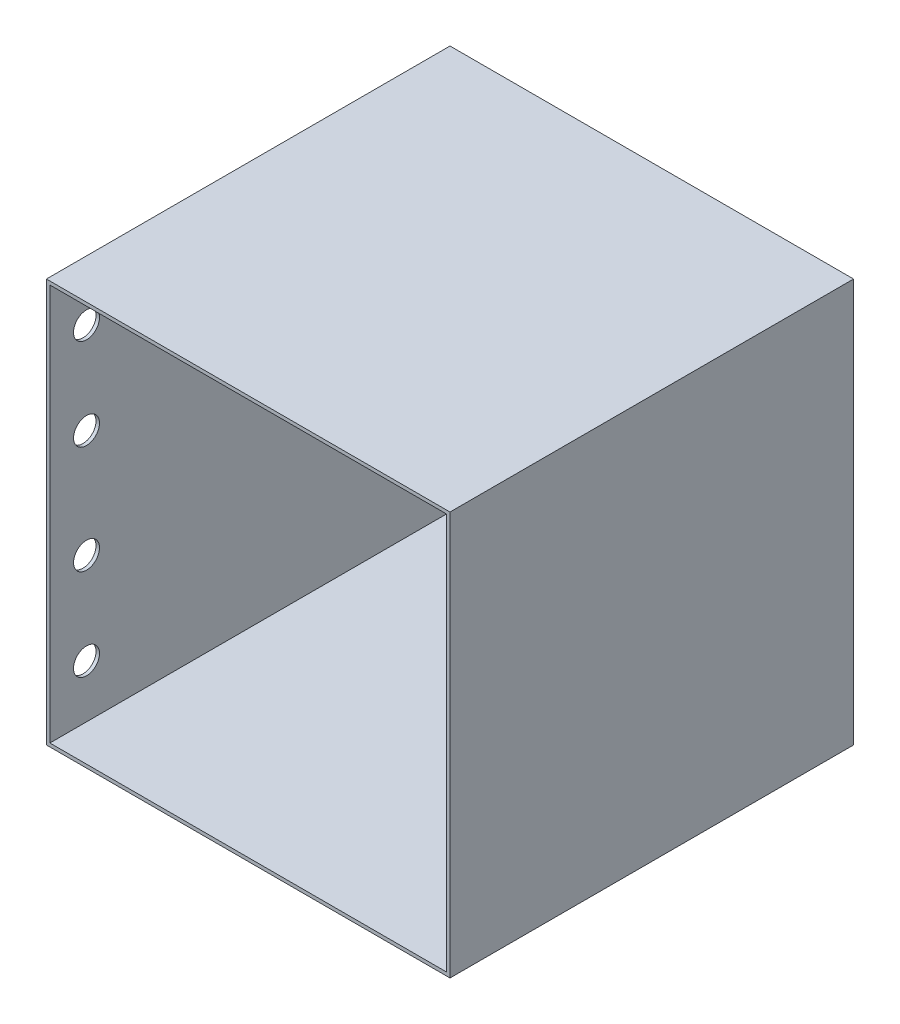
ISO-10303-21;
HEADER;
FILE_DESCRIPTION(('STEP AP214'),'2;1');
FILE_NAME('part.step','',(''),(''),'','','');
FILE_SCHEMA(('AUTOMOTIVE_DESIGN { 1 0 10303 214 1 1 1 1 }'));
ENDSEC;
DATA;
#1=APPLICATION_CONTEXT('core data for automotive mechanical design processes');
#2=APPLICATION_PROTOCOL_DEFINITION('international standard','automotive_design',2000,#1);
#3=PRODUCT_CONTEXT('',#1,'mechanical');
#4=PRODUCT('Part','Part','',(#3));
#5=PRODUCT_RELATED_PRODUCT_CATEGORY('part','',(#4));
#6=PRODUCT_DEFINITION_FORMATION('','',#4);
#7=PRODUCT_DEFINITION_CONTEXT('part definition',#1,'design');
#8=PRODUCT_DEFINITION('design','',#6,#7);
#9=PRODUCT_DEFINITION_SHAPE('','',#8);
#10=(LENGTH_UNIT() NAMED_UNIT(*) SI_UNIT(.MILLI.,.METRE.));
#11=(NAMED_UNIT(*) PLANE_ANGLE_UNIT() SI_UNIT($,.RADIAN.));
#12=(NAMED_UNIT(*) SI_UNIT($,.STERADIAN.) SOLID_ANGLE_UNIT());
#13=UNCERTAINTY_MEASURE_WITH_UNIT(LENGTH_MEASURE(1.E-05),#10,'distance_accuracy_value','');
#14=(GEOMETRIC_REPRESENTATION_CONTEXT(3) GLOBAL_UNCERTAINTY_ASSIGNED_CONTEXT((#13)) GLOBAL_UNIT_ASSIGNED_CONTEXT((#10,
#11,#12)) REPRESENTATION_CONTEXT('',''));
#15=CARTESIAN_POINT('',(0.,0.,0.));
#16=DIRECTION('',(0.,0.,1.));
#17=DIRECTION('',(1.,0.,0.));
#18=AXIS2_PLACEMENT_3D('',#15,#16,#17);
#19=CARTESIAN_POINT('',(0.,0.,70.));
#20=DIRECTION('',(0.,0.,-1.));
#21=DIRECTION('',(-1.,0.,0.));
#22=AXIS2_PLACEMENT_3D('',#19,#20,#21);
#23=PLANE('',#22);
#24=DIRECTION('',(0.,-1.,0.));
#25=VECTOR('',#24,1.);
#26=CARTESIAN_POINT('',(0.,0.,70.));
#27=LINE('',#26,#25);
#28=CARTESIAN_POINT('',(-1.11022302462516E-13,70.0000000000001,69.9999999999997));
#29=VERTEX_POINT('',#28);
#30=CARTESIAN_POINT('',(0.,0.,70.));
#31=VERTEX_POINT('',#30);
#32=EDGE_CURVE('E134',#29,#31,#27,.T.);
#33=ORIENTED_EDGE('',*,*,#32,.T.);
#34=DIRECTION('',(1.,0.,0.));
#35=VECTOR('',#34,1.);
#36=CARTESIAN_POINT('',(0.,0.,70.));
#37=LINE('',#36,#35);
#38=CARTESIAN_POINT('',(70.,0.,70.));
#39=VERTEX_POINT('',#38);
#40=EDGE_CURVE('E137',#31,#39,#37,.T.);
#41=ORIENTED_EDGE('',*,*,#40,.T.);
#42=DIRECTION('',(0.,1.,0.));
#43=VECTOR('',#42,1.);
#44=CARTESIAN_POINT('',(70.,0.,70.));
#45=LINE('',#44,#43);
#46=CARTESIAN_POINT('',(69.9999999999998,69.9999999999998,69.9999999999997));
#47=VERTEX_POINT('',#46);
#48=EDGE_CURVE('E140',#39,#47,#45,.T.);
#49=ORIENTED_EDGE('',*,*,#48,.T.);
#50=DIRECTION('',(-1.,0.,0.));
#51=VECTOR('',#50,1.);
#52=CARTESIAN_POINT('',(-1.11022302462516E-13,70.0000000000001,69.9999999999997));
#53=LINE('',#52,#51);
#54=EDGE_CURVE('E142',#47,#29,#53,.T.);
#55=ORIENTED_EDGE('',*,*,#54,.T.);
#56=EDGE_LOOP('',(#33,#41,#49,#55));
#57=FACE_BOUND('',#56,.T.);
#58=DIRECTION('',(0.,-1.,0.));
#59=VECTOR('',#58,1.);
#60=CARTESIAN_POINT('',(0.599999999999934,0.,70.));
#61=LINE('',#60,#59);
#62=CARTESIAN_POINT('',(0.599999999999518,69.3999999999999,69.9999999999997));
#63=VERTEX_POINT('',#62);
#64=CARTESIAN_POINT('',(0.600000000000045,0.599999999999934,70.));
#65=VERTEX_POINT('',#64);
#66=EDGE_CURVE('E122',#63,#65,#61,.T.);
#67=ORIENTED_EDGE('',*,*,#66,.F.);
#68=DIRECTION('',(-1.,0.,0.));
#69=VECTOR('',#68,1.);
#70=CARTESIAN_POINT('',(-5.27355936696949E-13,69.3999999999999,69.9999999999997));
#71=LINE('',#70,#69);
#72=CARTESIAN_POINT('',(69.3999999999998,69.3999999999999,69.9999999999997));
#73=VERTEX_POINT('',#72);
#74=EDGE_CURVE('E106',#73,#63,#71,.T.);
#75=ORIENTED_EDGE('',*,*,#74,.F.);
#76=DIRECTION('',(0.,1.,0.));
#77=VECTOR('',#76,1.);
#78=CARTESIAN_POINT('',(69.4,0.,70.));
#79=LINE('',#78,#77);
#80=CARTESIAN_POINT('',(69.4,0.599999999999934,70.));
#81=VERTEX_POINT('',#80);
#82=EDGE_CURVE('E131',#81,#73,#79,.T.);
#83=ORIENTED_EDGE('',*,*,#82,.F.);
#84=DIRECTION('',(1.,0.,0.));
#85=VECTOR('',#84,1.);
#86=CARTESIAN_POINT('',(0.,0.599999999999934,70.));
#87=LINE('',#86,#85);
#88=EDGE_CURVE('E124',#65,#81,#87,.T.);
#89=ORIENTED_EDGE('',*,*,#88,.F.);
#90=EDGE_LOOP('',(#67,#75,#83,#89));
#91=FACE_BOUND('',#90,.T.);
#92=ADVANCED_FACE('F36',(#57,#91),#23,.F.);
#93=CARTESIAN_POINT('',(0.,0.,0.));
#94=DIRECTION('',(0.,0.,-1.));
#95=DIRECTION('',(-1.,0.,0.));
#96=AXIS2_PLACEMENT_3D('',#93,#94,#95);
#97=PLANE('',#96);
#98=DIRECTION('',(0.,-1.,0.));
#99=VECTOR('',#98,1.);
#100=CARTESIAN_POINT('',(0.,0.,0.));
#101=LINE('',#100,#99);
#102=CARTESIAN_POINT('',(-1.11022302462516E-13,70.0000000000001,-3.33066907387547E-13));
#103=VERTEX_POINT('',#102);
#104=CARTESIAN_POINT('',(0.,0.,0.));
#105=VERTEX_POINT('',#104);
#106=EDGE_CURVE('E145',#103,#105,#101,.T.);
#107=ORIENTED_EDGE('',*,*,#106,.F.);
#108=DIRECTION('',(-1.,0.,0.));
#109=VECTOR('',#108,1.);
#110=CARTESIAN_POINT('',(-1.11022302462516E-13,70.0000000000001,-3.33066907387547E-13));
#111=LINE('',#110,#109);
#112=CARTESIAN_POINT('',(69.9999999999998,70.0000000000001,-3.33066907387547E-13));
#113=VERTEX_POINT('',#112);
#114=EDGE_CURVE('E138',#113,#103,#111,.T.);
#115=ORIENTED_EDGE('',*,*,#114,.F.);
#116=DIRECTION('',(0.,1.,0.));
#117=VECTOR('',#116,1.);
#118=CARTESIAN_POINT('',(70.,0.,0.));
#119=LINE('',#118,#117);
#120=CARTESIAN_POINT('',(70.,0.,0.));
#121=VERTEX_POINT('',#120);
#122=EDGE_CURVE('E150',#121,#113,#119,.T.);
#123=ORIENTED_EDGE('',*,*,#122,.F.);
#124=DIRECTION('',(1.,0.,0.));
#125=VECTOR('',#124,1.);
#126=CARTESIAN_POINT('',(0.,0.,0.));
#127=LINE('',#126,#125);
#128=EDGE_CURVE('E148',#105,#121,#127,.T.);
#129=ORIENTED_EDGE('',*,*,#128,.F.);
#130=EDGE_LOOP('',(#107,#115,#123,#129));
#131=FACE_BOUND('',#130,.T.);
#132=DIRECTION('',(-1.,0.,0.));
#133=VECTOR('',#132,1.);
#134=CARTESIAN_POINT('',(-5.27355936696949E-13,69.3999999999999,-3.33066907387547E-13));
#135=LINE('',#134,#133);
#136=CARTESIAN_POINT('',(69.3999999999998,69.3999999999999,-3.33066907387547E-13));
#137=VERTEX_POINT('',#136);
#138=CARTESIAN_POINT('',(0.599999999999518,69.3999999999999,-3.33066907387547E-13));
#139=VERTEX_POINT('',#138);
#140=EDGE_CURVE('E104',#137,#139,#135,.T.);
#141=ORIENTED_EDGE('',*,*,#140,.T.);
#142=DIRECTION('',(0.,-1.,0.));
#143=VECTOR('',#142,1.);
#144=CARTESIAN_POINT('',(0.599999999999934,0.,0.));
#145=LINE('',#144,#143);
#146=CARTESIAN_POINT('',(0.600000000000045,0.599999999999934,0.));
#147=VERTEX_POINT('',#146);
#148=EDGE_CURVE('E112',#139,#147,#145,.T.);
#149=ORIENTED_EDGE('',*,*,#148,.T.);
#150=DIRECTION('',(1.,0.,0.));
#151=VECTOR('',#150,1.);
#152=CARTESIAN_POINT('',(0.,0.599999999999934,0.));
#153=LINE('',#152,#151);
#154=CARTESIAN_POINT('',(69.4,0.599999999999934,0.));
#155=VERTEX_POINT('',#154);
#156=EDGE_CURVE('E118',#147,#155,#153,.T.);
#157=ORIENTED_EDGE('',*,*,#156,.T.);
#158=DIRECTION('',(0.,1.,0.));
#159=VECTOR('',#158,1.);
#160=CARTESIAN_POINT('',(69.4,0.,0.));
#161=LINE('',#160,#159);
#162=EDGE_CURVE('E58',#155,#137,#161,.T.);
#163=ORIENTED_EDGE('',*,*,#162,.T.);
#164=EDGE_LOOP('',(#141,#149,#157,#163));
#165=FACE_BOUND('',#164,.T.);
#166=ADVANCED_FACE('F121',(#131,#165),#97,.T.);
#167=CARTESIAN_POINT('',(0.,0.,70.));
#168=DIRECTION('',(1.,0.,0.));
#169=DIRECTION('',(0.,0.,-1.));
#170=AXIS2_PLACEMENT_3D('',#167,#168,#169);
#171=PLANE('',#170);
#172=CARTESIAN_POINT('',(-4.16333634234434E-13,9.76250000000012,63.6499999999993));
#173=DIRECTION('',(1.,0.,0.));
#174=DIRECTION('',(0.,0.,-1.));
#175=AXIS2_PLACEMENT_3D('',#172,#173,#174);
#176=CIRCLE('',#175,2.24999999999999);
#177=CARTESIAN_POINT('',(-4.16333634234434E-13,9.76250000000012,61.3999999999993));
#178=VERTEX_POINT('',#177);
#179=EDGE_CURVE('E253',#178,#178,#176,.T.);
#180=ORIENTED_EDGE('',*,*,#179,.T.);
#181=EDGE_LOOP('',(#180));
#182=FACE_BOUND('',#181,.T.);
#183=CARTESIAN_POINT('',(-4.16333634234434E-13,25.6374999999998,63.6499999999995));
#184=DIRECTION('',(1.,0.,0.));
#185=DIRECTION('',(0.,0.,-1.));
#186=AXIS2_PLACEMENT_3D('',#183,#184,#185);
#187=CIRCLE('',#186,2.25);
#188=CARTESIAN_POINT('',(-4.16333634234434E-13,25.6374999999998,61.3999999999995));
#189=VERTEX_POINT('',#188);
#190=EDGE_CURVE('E247',#189,#189,#187,.T.);
#191=ORIENTED_EDGE('',*,*,#190,.T.);
#192=EDGE_LOOP('',(#191));
#193=FACE_BOUND('',#192,.T.);
#194=CARTESIAN_POINT('',(0.,44.3625000000001,63.6499999999975));
#195=DIRECTION('',(1.,0.,0.));
#196=DIRECTION('',(0.,0.,-1.));
#197=AXIS2_PLACEMENT_3D('',#194,#195,#196);
#198=CIRCLE('',#197,2.25);
#199=CARTESIAN_POINT('',(0.,44.3625000000001,61.3999999999975));
#200=VERTEX_POINT('',#199);
#201=EDGE_CURVE('E234',#200,#200,#198,.T.);
#202=ORIENTED_EDGE('',*,*,#201,.T.);
#203=EDGE_LOOP('',(#202));
#204=FACE_BOUND('',#203,.T.);
#205=CARTESIAN_POINT('',(0.,60.2374999999999,63.6499999999994));
#206=DIRECTION('',(1.,0.,0.));
#207=DIRECTION('',(0.,0.,-1.));
#208=AXIS2_PLACEMENT_3D('',#205,#206,#207);
#209=CIRCLE('',#208,2.25);
#210=CARTESIAN_POINT('',(0.,60.2374999999999,61.3999999999994));
#211=VERTEX_POINT('',#210);
#212=EDGE_CURVE('E119',#211,#211,#209,.T.);
#213=ORIENTED_EDGE('',*,*,#212,.T.);
#214=EDGE_LOOP('',(#213));
#215=FACE_BOUND('',#214,.T.);
#216=ORIENTED_EDGE('',*,*,#106,.T.);
#217=DIRECTION('',(0.,0.,-1.));
#218=VECTOR('',#217,1.);
#219=CARTESIAN_POINT('',(0.,0.,70.));
#220=LINE('',#219,#218);
#221=EDGE_CURVE('E11',#31,#105,#220,.T.);
#222=ORIENTED_EDGE('',*,*,#221,.F.);
#223=ORIENTED_EDGE('',*,*,#32,.F.);
#224=DIRECTION('',(0.,0.,-1.));
#225=VECTOR('',#224,1.);
#226=CARTESIAN_POINT('',(-1.11022302462516E-13,70.0000000000001,69.9999999999997));
#227=LINE('',#226,#225);
#228=EDGE_CURVE('E144',#29,#103,#227,.T.);
#229=ORIENTED_EDGE('',*,*,#228,.T.);
#230=EDGE_LOOP('',(#216,#222,#223,#229));
#231=FACE_BOUND('',#230,.T.);
#232=ADVANCED_FACE('F38',(#182,#193,#204,#215,#231),#171,.F.);
#233=CARTESIAN_POINT('',(0.,0.,70.));
#234=DIRECTION('',(0.,1.,0.));
#235=DIRECTION('',(0.,0.,1.));
#236=AXIS2_PLACEMENT_3D('',#233,#234,#235);
#237=PLANE('',#236);
#238=ORIENTED_EDGE('',*,*,#128,.T.);
#239=DIRECTION('',(0.,0.,-1.));
#240=VECTOR('',#239,1.);
#241=CARTESIAN_POINT('',(70.,0.,70.));
#242=LINE('',#241,#240);
#243=EDGE_CURVE('E44',#39,#121,#242,.T.);
#244=ORIENTED_EDGE('',*,*,#243,.F.);
#245=ORIENTED_EDGE('',*,*,#40,.F.);
#246=ORIENTED_EDGE('',*,*,#221,.T.);
#247=EDGE_LOOP('',(#238,#244,#245,#246));
#248=FACE_BOUND('',#247,.T.);
#249=ADVANCED_FACE('F177',(#248),#237,.F.);
#250=CARTESIAN_POINT('',(70.,0.,70.));
#251=DIRECTION('',(-1.,0.,0.));
#252=DIRECTION('',(0.,0.,1.));
#253=AXIS2_PLACEMENT_3D('',#250,#251,#252);
#254=PLANE('',#253);
#255=ORIENTED_EDGE('',*,*,#122,.T.);
#256=DIRECTION('',(0.,0.,-1.));
#257=VECTOR('',#256,1.);
#258=CARTESIAN_POINT('',(69.9999999999998,69.9999999999998,69.9999999999997));
#259=LINE('',#258,#257);
#260=EDGE_CURVE('E155',#47,#113,#259,.T.);
#261=ORIENTED_EDGE('',*,*,#260,.F.);
#262=ORIENTED_EDGE('',*,*,#48,.F.);
#263=ORIENTED_EDGE('',*,*,#243,.T.);
#264=EDGE_LOOP('',(#255,#261,#262,#263));
#265=FACE_BOUND('',#264,.T.);
#266=ADVANCED_FACE('F162',(#265),#254,.F.);
#267=CARTESIAN_POINT('',(-1.11022302462516E-13,70.0000000000001,69.9999999999997));
#268=DIRECTION('',(0.,-1.,0.));
#269=DIRECTION('',(0.,0.,-1.));
#270=AXIS2_PLACEMENT_3D('',#267,#268,#269);
#271=PLANE('',#270);
#272=ORIENTED_EDGE('',*,*,#114,.T.);
#273=ORIENTED_EDGE('',*,*,#228,.F.);
#274=ORIENTED_EDGE('',*,*,#54,.F.);
#275=ORIENTED_EDGE('',*,*,#260,.T.);
#276=EDGE_LOOP('',(#272,#273,#274,#275));
#277=FACE_BOUND('',#276,.T.);
#278=ADVANCED_FACE('F170',(#277),#271,.F.);
#279=CARTESIAN_POINT('',(0.599999999999934,0.,70.));
#280=DIRECTION('',(1.,0.,0.));
#281=DIRECTION('',(0.,0.,-1.));
#282=AXIS2_PLACEMENT_3D('',#279,#280,#281);
#283=PLANE('',#282);
#284=CARTESIAN_POINT('',(0.599999999999629,9.76250000000012,63.6499999999993));
#285=DIRECTION('',(-1.,0.,0.));
#286=DIRECTION('',(0.,0.,1.));
#287=AXIS2_PLACEMENT_3D('',#284,#285,#286);
#288=CIRCLE('',#287,2.25);
#289=CARTESIAN_POINT('',(0.599999999999629,9.76250000000012,65.8999999999993));
#290=VERTEX_POINT('',#289);
#291=EDGE_CURVE('E256',#290,#290,#288,.T.);
#292=ORIENTED_EDGE('',*,*,#291,.T.);
#293=EDGE_LOOP('',(#292));
#294=FACE_BOUND('',#293,.T.);
#295=CARTESIAN_POINT('',(0.599999999999629,25.6374999999998,63.6499999999995));
#296=DIRECTION('',(-1.,0.,0.));
#297=DIRECTION('',(0.,0.,1.));
#298=AXIS2_PLACEMENT_3D('',#295,#296,#297);
#299=CIRCLE('',#298,2.25);
#300=CARTESIAN_POINT('',(0.599999999999629,25.6374999999998,65.8999999999995));
#301=VERTEX_POINT('',#300);
#302=EDGE_CURVE('E250',#301,#301,#299,.T.);
#303=ORIENTED_EDGE('',*,*,#302,.T.);
#304=EDGE_LOOP('',(#303));
#305=FACE_BOUND('',#304,.T.);
#306=CARTESIAN_POINT('',(0.600000000000045,44.3625000000001,63.6499999999975));
#307=DIRECTION('',(-1.,0.,0.));
#308=DIRECTION('',(0.,0.,1.));
#309=AXIS2_PLACEMENT_3D('',#306,#307,#308);
#310=CIRCLE('',#309,2.25);
#311=CARTESIAN_POINT('',(0.600000000000045,44.3625000000001,65.8999999999975));
#312=VERTEX_POINT('',#311);
#313=EDGE_CURVE('E244',#312,#312,#310,.T.);
#314=ORIENTED_EDGE('',*,*,#313,.T.);
#315=EDGE_LOOP('',(#314));
#316=FACE_BOUND('',#315,.T.);
#317=CARTESIAN_POINT('',(0.600000000000045,60.2374999999999,63.6499999999994));
#318=DIRECTION('',(-1.,0.,0.));
#319=DIRECTION('',(0.,0.,1.));
#320=AXIS2_PLACEMENT_3D('',#317,#318,#319);
#321=CIRCLE('',#320,2.25);
#322=CARTESIAN_POINT('',(0.600000000000045,60.2374999999999,65.8999999999994));
#323=VERTEX_POINT('',#322);
#324=EDGE_CURVE('E229',#323,#323,#321,.T.);
#325=ORIENTED_EDGE('',*,*,#324,.T.);
#326=EDGE_LOOP('',(#325));
#327=FACE_BOUND('',#326,.T.);
#328=ORIENTED_EDGE('',*,*,#148,.F.);
#329=DIRECTION('',(0.,0.,-1.));
#330=VECTOR('',#329,1.);
#331=CARTESIAN_POINT('',(0.599999999999518,69.3999999999999,69.9999999999997));
#332=LINE('',#331,#330);
#333=EDGE_CURVE('E100',#63,#139,#332,.T.);
#334=ORIENTED_EDGE('',*,*,#333,.F.);
#335=ORIENTED_EDGE('',*,*,#66,.T.);
#336=DIRECTION('',(0.,0.,-1.));
#337=VECTOR('',#336,1.);
#338=CARTESIAN_POINT('',(0.600000000000045,0.599999999999934,70.));
#339=LINE('',#338,#337);
#340=EDGE_CURVE('E115',#65,#147,#339,.T.);
#341=ORIENTED_EDGE('',*,*,#340,.T.);
#342=EDGE_LOOP('',(#328,#334,#335,#341));
#343=FACE_BOUND('',#342,.T.);
#344=ADVANCED_FACE('F113',(#294,#305,#316,#327,#343),#283,.T.);
#345=CARTESIAN_POINT('',(0.,0.599999999999934,70.));
#346=DIRECTION('',(0.,1.,0.));
#347=DIRECTION('',(0.,0.,1.));
#348=AXIS2_PLACEMENT_3D('',#345,#346,#347);
#349=PLANE('',#348);
#350=ORIENTED_EDGE('',*,*,#156,.F.);
#351=ORIENTED_EDGE('',*,*,#340,.F.);
#352=ORIENTED_EDGE('',*,*,#88,.T.);
#353=DIRECTION('',(0.,0.,-1.));
#354=VECTOR('',#353,1.);
#355=CARTESIAN_POINT('',(69.4,0.599999999999934,70.));
#356=LINE('',#355,#354);
#357=EDGE_CURVE('E238',#81,#155,#356,.T.);
#358=ORIENTED_EDGE('',*,*,#357,.T.);
#359=EDGE_LOOP('',(#350,#351,#352,#358));
#360=FACE_BOUND('',#359,.T.);
#361=ADVANCED_FACE('F198',(#360),#349,.T.);
#362=CARTESIAN_POINT('',(69.4,0.,70.));
#363=DIRECTION('',(-1.,0.,0.));
#364=DIRECTION('',(0.,0.,1.));
#365=AXIS2_PLACEMENT_3D('',#362,#363,#364);
#366=PLANE('',#365);
#367=ORIENTED_EDGE('',*,*,#162,.F.);
#368=ORIENTED_EDGE('',*,*,#357,.F.);
#369=ORIENTED_EDGE('',*,*,#82,.T.);
#370=DIRECTION('',(0.,0.,-1.));
#371=VECTOR('',#370,1.);
#372=CARTESIAN_POINT('',(69.3999999999998,69.3999999999999,69.9999999999997));
#373=LINE('',#372,#371);
#374=EDGE_CURVE('E51',#73,#137,#373,.T.);
#375=ORIENTED_EDGE('',*,*,#374,.T.);
#376=EDGE_LOOP('',(#367,#368,#369,#375));
#377=FACE_BOUND('',#376,.T.);
#378=ADVANCED_FACE('F204',(#377),#366,.T.);
#379=CARTESIAN_POINT('',(-5.27355936696949E-13,69.3999999999999,69.9999999999997));
#380=DIRECTION('',(0.,-1.,0.));
#381=DIRECTION('',(0.,0.,-1.));
#382=AXIS2_PLACEMENT_3D('',#379,#380,#381);
#383=PLANE('',#382);
#384=ORIENTED_EDGE('',*,*,#140,.F.);
#385=ORIENTED_EDGE('',*,*,#374,.F.);
#386=ORIENTED_EDGE('',*,*,#74,.T.);
#387=ORIENTED_EDGE('',*,*,#333,.T.);
#388=EDGE_LOOP('',(#384,#385,#386,#387));
#389=FACE_BOUND('',#388,.T.);
#390=ADVANCED_FACE('F102',(#389),#383,.T.);
#391=CARTESIAN_POINT('',(-1.00000000000211,60.2374999999999,63.6499999999994));
#392=DIRECTION('',(-1.,0.,0.));
#393=DIRECTION('',(0.,0.,1.));
#394=AXIS2_PLACEMENT_3D('',#391,#392,#393);
#395=CYLINDRICAL_SURFACE('',#394,2.25);
#396=ORIENTED_EDGE('',*,*,#324,.F.);
#397=EDGE_LOOP('',(#396));
#398=FACE_BOUND('',#397,.T.);
#399=ORIENTED_EDGE('',*,*,#212,.F.);
#400=EDGE_LOOP('',(#399));
#401=FACE_BOUND('',#400,.T.);
#402=ADVANCED_FACE('F210',(#398,#401),#395,.F.);
#403=CARTESIAN_POINT('',(-1.00000000000211,44.3625000000001,63.6499999999975));
#404=DIRECTION('',(-1.,0.,0.));
#405=DIRECTION('',(0.,0.,1.));
#406=AXIS2_PLACEMENT_3D('',#403,#404,#405);
#407=CYLINDRICAL_SURFACE('',#406,2.25);
#408=ORIENTED_EDGE('',*,*,#313,.F.);
#409=EDGE_LOOP('',(#408));
#410=FACE_BOUND('',#409,.T.);
#411=ORIENTED_EDGE('',*,*,#201,.F.);
#412=EDGE_LOOP('',(#411));
#413=FACE_BOUND('',#412,.T.);
#414=ADVANCED_FACE('F219',(#410,#413),#407,.F.);
#415=CARTESIAN_POINT('',(-1.00000000000253,25.6374999999998,63.6499999999995));
#416=DIRECTION('',(-1.,0.,0.));
#417=DIRECTION('',(0.,0.,1.));
#418=AXIS2_PLACEMENT_3D('',#415,#416,#417);
#419=CYLINDRICAL_SURFACE('',#418,2.25);
#420=ORIENTED_EDGE('',*,*,#302,.F.);
#421=EDGE_LOOP('',(#420));
#422=FACE_BOUND('',#421,.T.);
#423=ORIENTED_EDGE('',*,*,#190,.F.);
#424=EDGE_LOOP('',(#423));
#425=FACE_BOUND('',#424,.T.);
#426=ADVANCED_FACE('F224',(#422,#425),#419,.F.);
#427=CARTESIAN_POINT('',(-1.00000000000253,9.76250000000012,63.6499999999993));
#428=DIRECTION('',(-1.,0.,0.));
#429=DIRECTION('',(0.,0.,1.));
#430=AXIS2_PLACEMENT_3D('',#427,#428,#429);
#431=CYLINDRICAL_SURFACE('',#430,2.24999999999999);
#432=ORIENTED_EDGE('',*,*,#291,.F.);
#433=EDGE_LOOP('',(#432));
#434=FACE_BOUND('',#433,.T.);
#435=ORIENTED_EDGE('',*,*,#179,.F.);
#436=EDGE_LOOP('',(#435));
#437=FACE_BOUND('',#436,.T.);
#438=ADVANCED_FACE('F259',(#434,#437),#431,.F.);
#439=CLOSED_SHELL('',(#92,#166,#232,#249,#266,#278,#344,#361,#378,#390,#402,#414,#426,#438));
#440=MANIFOLD_SOLID_BREP('B2',#439);
#441=ADVANCED_BREP_SHAPE_REPRESENTATION('',(#18,#440),#14);
#442=SHAPE_DEFINITION_REPRESENTATION(#9,#441);
ENDSEC;
END-ISO-10303-21;
